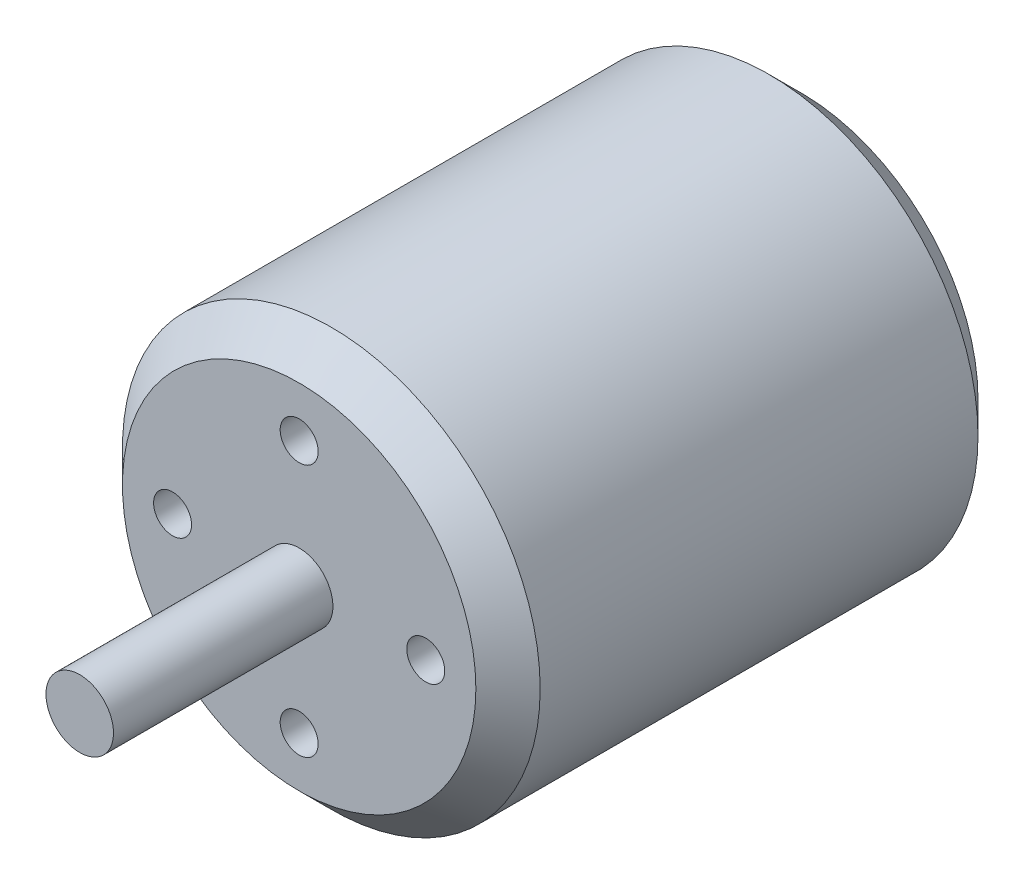
ISO-10303-21;
HEADER;
FILE_DESCRIPTION(('STEP AP214'),'2;1');
FILE_NAME('part.step','',(''),(''),'','','');
FILE_SCHEMA(('AUTOMOTIVE_DESIGN { 1 0 10303 214 1 1 1 1 }'));
ENDSEC;
DATA;
#1=APPLICATION_CONTEXT('core data for automotive mechanical design processes');
#2=APPLICATION_PROTOCOL_DEFINITION('international standard','automotive_design',2000,#1);
#3=PRODUCT_CONTEXT('',#1,'mechanical');
#4=PRODUCT('Part','Part','',(#3));
#5=PRODUCT_RELATED_PRODUCT_CATEGORY('part','',(#4));
#6=PRODUCT_DEFINITION_FORMATION('','',#4);
#7=PRODUCT_DEFINITION_CONTEXT('part definition',#1,'design');
#8=PRODUCT_DEFINITION('design','',#6,#7);
#9=PRODUCT_DEFINITION_SHAPE('','',#8);
#10=(LENGTH_UNIT() NAMED_UNIT(*) SI_UNIT(.MILLI.,.METRE.));
#11=(NAMED_UNIT(*) PLANE_ANGLE_UNIT() SI_UNIT($,.RADIAN.));
#12=(NAMED_UNIT(*) SI_UNIT($,.STERADIAN.) SOLID_ANGLE_UNIT());
#13=UNCERTAINTY_MEASURE_WITH_UNIT(LENGTH_MEASURE(1.E-05),#10,'distance_accuracy_value','');
#14=(GEOMETRIC_REPRESENTATION_CONTEXT(3) GLOBAL_UNCERTAINTY_ASSIGNED_CONTEXT((#13)) GLOBAL_UNIT_ASSIGNED_CONTEXT((#10,
#11,#12)) REPRESENTATION_CONTEXT('',''));
#15=CARTESIAN_POINT('',(0.,0.,0.));
#16=DIRECTION('',(0.,0.,1.));
#17=DIRECTION('',(1.,0.,0.));
#18=AXIS2_PLACEMENT_3D('',#15,#16,#17);
#19=CARTESIAN_POINT('',(0.,0.,59.5));
#20=DIRECTION('',(0.,0.,-1.));
#21=DIRECTION('',(-1.,0.,0.));
#22=AXIS2_PLACEMENT_3D('',#19,#20,#21);
#23=CYLINDRICAL_SURFACE('',#22,24.75);
#24=CARTESIAN_POINT('',(0.,0.,3.81000000000001));
#25=DIRECTION('',(0.,0.,1.));
#26=DIRECTION('',(1.,0.,0.));
#27=AXIS2_PLACEMENT_3D('',#24,#25,#26);
#28=CIRCLE('',#27,24.75);
#29=CARTESIAN_POINT('',(24.75,0.,3.81000000000001));
#30=VERTEX_POINT('',#29);
#31=EDGE_CURVE('E47',#30,#30,#28,.T.);
#32=ORIENTED_EDGE('',*,*,#31,.T.);
#33=EDGE_LOOP('',(#32));
#34=FACE_BOUND('',#33,.T.);
#35=CARTESIAN_POINT('',(0.,0.,55.69));
#36=DIRECTION('',(0.,0.,1.));
#37=DIRECTION('',(1.,0.,0.));
#38=AXIS2_PLACEMENT_3D('',#35,#36,#37);
#39=CIRCLE('',#38,24.75);
#40=CARTESIAN_POINT('',(24.75,0.,55.69));
#41=VERTEX_POINT('',#40);
#42=EDGE_CURVE('E52',#41,#41,#39,.F.);
#43=ORIENTED_EDGE('',*,*,#42,.T.);
#44=EDGE_LOOP('',(#43));
#45=FACE_BOUND('',#44,.T.);
#46=ADVANCED_FACE('F38',(#34,#45),#23,.T.);
#47=CARTESIAN_POINT('',(0.,0.,59.5));
#48=DIRECTION('',(0.,0.,1.));
#49=DIRECTION('',(1.,0.,0.));
#50=AXIS2_PLACEMENT_3D('',#47,#48,#49);
#51=PLANE('',#50);
#52=CARTESIAN_POINT('',(0.,15.,59.5));
#53=DIRECTION('',(0.,0.,1.));
#54=DIRECTION('',(1.,0.,0.));
#55=AXIS2_PLACEMENT_3D('',#52,#53,#54);
#56=CIRCLE('',#55,2.25);
#57=CARTESIAN_POINT('',(2.25,15.,59.5));
#58=VERTEX_POINT('',#57);
#59=EDGE_CURVE('E96',#58,#58,#56,.T.);
#60=ORIENTED_EDGE('',*,*,#59,.F.);
#61=EDGE_LOOP('',(#60));
#62=FACE_BOUND('',#61,.T.);
#63=CARTESIAN_POINT('',(15.0000000000004,4.23570186157979E-13,59.5));
#64=DIRECTION('',(0.,0.,1.));
#65=DIRECTION('',(1.,0.,0.));
#66=AXIS2_PLACEMENT_3D('',#63,#64,#65);
#67=CIRCLE('',#66,2.25000000000033);
#68=CARTESIAN_POINT('',(17.2500000000007,4.23570186157979E-13,59.5));
#69=VERTEX_POINT('',#68);
#70=EDGE_CURVE('E88',#69,#69,#67,.T.);
#71=ORIENTED_EDGE('',*,*,#70,.F.);
#72=EDGE_LOOP('',(#71));
#73=FACE_BOUND('',#72,.T.);
#74=CARTESIAN_POINT('',(8.47140372315957E-13,-15.,59.5));
#75=DIRECTION('',(0.,0.,1.));
#76=DIRECTION('',(1.,0.,0.));
#77=AXIS2_PLACEMENT_3D('',#74,#75,#76);
#78=CIRCLE('',#77,2.25000000000091);
#79=CARTESIAN_POINT('',(2.25000000000176,-15.,59.5));
#80=VERTEX_POINT('',#79);
#81=EDGE_CURVE('E80',#80,#80,#78,.T.);
#82=ORIENTED_EDGE('',*,*,#81,.F.);
#83=EDGE_LOOP('',(#82));
#84=FACE_BOUND('',#83,.T.);
#85=CARTESIAN_POINT('',(-14.9999999999996,-4.254071563567E-13,59.5));
#86=DIRECTION('',(0.,0.,1.));
#87=DIRECTION('',(1.,0.,0.));
#88=AXIS2_PLACEMENT_3D('',#85,#86,#87);
#89=CIRCLE('',#88,2.25000000000068);
#90=CARTESIAN_POINT('',(-12.7499999999989,-4.254071563567E-13,59.5));
#91=VERTEX_POINT('',#90);
#92=EDGE_CURVE('E72',#91,#91,#89,.T.);
#93=ORIENTED_EDGE('',*,*,#92,.F.);
#94=EDGE_LOOP('',(#93));
#95=FACE_BOUND('',#94,.T.);
#96=CARTESIAN_POINT('',(0.,0.,59.5));
#97=DIRECTION('',(0.,0.,1.));
#98=DIRECTION('',(1.,0.,0.));
#99=AXIS2_PLACEMENT_3D('',#96,#97,#98);
#100=CIRCLE('',#99,20.94);
#101=CARTESIAN_POINT('',(20.94,0.,59.5));
#102=VERTEX_POINT('',#101);
#103=EDGE_CURVE('E57',#102,#102,#100,.T.);
#104=ORIENTED_EDGE('',*,*,#103,.T.);
#105=EDGE_LOOP('',(#104));
#106=FACE_BOUND('',#105,.T.);
#107=CARTESIAN_POINT('',(0.,0.,59.5));
#108=DIRECTION('',(0.,0.,1.));
#109=DIRECTION('',(1.,0.,0.));
#110=AXIS2_PLACEMENT_3D('',#107,#108,#109);
#111=CIRCLE('',#110,4.);
#112=CARTESIAN_POINT('',(-4.,0.,59.5));
#113=VERTEX_POINT('',#112);
#114=EDGE_CURVE('E63',#113,#113,#111,.T.);
#115=ORIENTED_EDGE('',*,*,#114,.F.);
#116=EDGE_LOOP('',(#115));
#117=FACE_BOUND('',#116,.T.);
#118=ADVANCED_FACE('F113',(#62,#73,#84,#95,#106,#117),#51,.T.);
#119=CARTESIAN_POINT('',(0.,0.,0.));
#120=DIRECTION('',(0.,0.,1.));
#121=DIRECTION('',(1.,0.,0.));
#122=AXIS2_PLACEMENT_3D('',#119,#120,#121);
#123=PLANE('',#122);
#124=CARTESIAN_POINT('',(0.,0.,0.));
#125=DIRECTION('',(0.,0.,1.));
#126=DIRECTION('',(1.,0.,0.));
#127=AXIS2_PLACEMENT_3D('',#124,#125,#126);
#128=CIRCLE('',#127,20.94);
#129=CARTESIAN_POINT('',(20.94,0.,0.));
#130=VERTEX_POINT('',#129);
#131=EDGE_CURVE('E10',#130,#130,#128,.F.);
#132=ORIENTED_EDGE('',*,*,#131,.T.);
#133=EDGE_LOOP('',(#132));
#134=FACE_BOUND('',#133,.T.);
#135=ADVANCED_FACE('F116',(#134),#123,.F.);
#136=CARTESIAN_POINT('',(0.,0.,85.5));
#137=DIRECTION('',(0.,0.,-1.));
#138=DIRECTION('',(-1.,0.,0.));
#139=AXIS2_PLACEMENT_3D('',#136,#137,#138);
#140=CYLINDRICAL_SURFACE('',#139,4.);
#141=CARTESIAN_POINT('',(0.,0.,85.5));
#142=DIRECTION('',(0.,0.,1.));
#143=DIRECTION('',(1.,0.,0.));
#144=AXIS2_PLACEMENT_3D('',#141,#142,#143);
#145=CIRCLE('',#144,4.);
#146=CARTESIAN_POINT('',(-4.,0.,85.5));
#147=VERTEX_POINT('',#146);
#148=EDGE_CURVE('E67',#147,#147,#145,.T.);
#149=CARTESIAN_POINT('',(-4.,0.,85.5));
#150=CARTESIAN_POINT('',(-4.,0.,85.2291666666666));
#151=CARTESIAN_POINT('',(-4.,0.,84.9583333333333));
#152=CARTESIAN_POINT('',(-4.,0.,84.4166666666667));
#153=CARTESIAN_POINT('',(-4.,0.,84.1458333333333));
#154=CARTESIAN_POINT('',(-4.,0.,83.6041666666667));
#155=CARTESIAN_POINT('',(-4.,0.,83.3333333333333));
#156=CARTESIAN_POINT('',(-4.,0.,82.7916666666667));
#157=CARTESIAN_POINT('',(-4.,0.,82.5208333333333));
#158=CARTESIAN_POINT('',(-4.,0.,81.9791666666667));
#159=CARTESIAN_POINT('',(-4.,0.,81.7083333333333));
#160=CARTESIAN_POINT('',(-4.,0.,81.1666666666667));
#161=CARTESIAN_POINT('',(-4.,0.,80.8958333333333));
#162=CARTESIAN_POINT('',(-4.,0.,80.3541666666667));
#163=CARTESIAN_POINT('',(-4.,0.,80.0833333333333));
#164=CARTESIAN_POINT('',(-4.,0.,79.5416666666666));
#165=CARTESIAN_POINT('',(-4.,0.,79.2708333333333));
#166=CARTESIAN_POINT('',(-4.,0.,78.7291666666667));
#167=CARTESIAN_POINT('',(-4.,0.,78.4583333333333));
#168=CARTESIAN_POINT('',(-4.,0.,77.9166666666667));
#169=CARTESIAN_POINT('',(-4.,0.,77.6458333333333));
#170=CARTESIAN_POINT('',(-4.,0.,77.1041666666667));
#171=CARTESIAN_POINT('',(-4.,0.,76.8333333333333));
#172=CARTESIAN_POINT('',(-4.,0.,76.2916666666667));
#173=CARTESIAN_POINT('',(-4.,0.,76.0208333333333));
#174=CARTESIAN_POINT('',(-4.,0.,75.4791666666667));
#175=CARTESIAN_POINT('',(-4.,0.,75.2083333333333));
#176=CARTESIAN_POINT('',(-4.,0.,74.6666666666667));
#177=CARTESIAN_POINT('',(-4.,0.,74.3958333333333));
#178=CARTESIAN_POINT('',(-4.,0.,73.8541666666667));
#179=CARTESIAN_POINT('',(-4.,0.,73.5833333333333));
#180=CARTESIAN_POINT('',(-4.,0.,73.0416666666667));
#181=CARTESIAN_POINT('',(-4.,0.,72.7708333333333));
#182=CARTESIAN_POINT('',(-4.,0.,72.2291666666667));
#183=CARTESIAN_POINT('',(-4.,0.,71.9583333333333));
#184=CARTESIAN_POINT('',(-4.,0.,71.4166666666667));
#185=CARTESIAN_POINT('',(-4.,0.,71.1458333333333));
#186=CARTESIAN_POINT('',(-4.,0.,70.6041666666667));
#187=CARTESIAN_POINT('',(-4.,0.,70.3333333333333));
#188=CARTESIAN_POINT('',(-4.,0.,69.7916666666667));
#189=CARTESIAN_POINT('',(-4.,0.,69.5208333333333));
#190=CARTESIAN_POINT('',(-4.,0.,68.9791666666667));
#191=CARTESIAN_POINT('',(-4.,0.,68.7083333333333));
#192=CARTESIAN_POINT('',(-4.,0.,68.1666666666667));
#193=CARTESIAN_POINT('',(-4.,0.,67.8958333333333));
#194=CARTESIAN_POINT('',(-4.,0.,67.3541666666667));
#195=CARTESIAN_POINT('',(-4.,0.,67.0833333333333));
#196=CARTESIAN_POINT('',(-4.,0.,66.5416666666667));
#197=CARTESIAN_POINT('',(-4.,0.,66.2708333333333));
#198=CARTESIAN_POINT('',(-4.,0.,65.7291666666667));
#199=CARTESIAN_POINT('',(-4.,0.,65.4583333333333));
#200=CARTESIAN_POINT('',(-4.,0.,64.9166666666667));
#201=CARTESIAN_POINT('',(-4.,0.,64.6458333333333));
#202=CARTESIAN_POINT('',(-4.,0.,64.1041666666667));
#203=CARTESIAN_POINT('',(-4.,0.,63.8333333333333));
#204=CARTESIAN_POINT('',(-4.,0.,63.2916666666667));
#205=CARTESIAN_POINT('',(-4.,0.,63.0208333333333));
#206=CARTESIAN_POINT('',(-4.,0.,62.4791666666667));
#207=CARTESIAN_POINT('',(-4.,0.,62.2083333333333));
#208=CARTESIAN_POINT('',(-4.,0.,61.6666666666667));
#209=CARTESIAN_POINT('',(-4.,0.,61.3958333333333));
#210=CARTESIAN_POINT('',(-4.,0.,60.8541666666667));
#211=CARTESIAN_POINT('',(-4.,0.,60.5833333333333));
#212=CARTESIAN_POINT('',(-4.,0.,60.0416666666667));
#213=CARTESIAN_POINT('',(-4.,0.,59.7708333333333));
#214=CARTESIAN_POINT('',(-4.,0.,59.5));
#215=B_SPLINE_CURVE_WITH_KNOTS('',3,(#149,#150,#151,#152,#153,#154,#155,#156,#157,#158,#159,
#160,#161,#162,#163,#164,#165,#166,#167,#168,#169,#170,#171,#172,#173,#174,#175,#176,#177,#178,
#179,#180,#181,#182,#183,#184,#185,#186,#187,#188,#189,#190,#191,#192,#193,#194,#195,#196,#197,
#198,#199,#200,#201,#202,#203,#204,#205,#206,#207,#208,#209,#210,#211,#212,#213,#214),
.UNSPECIFIED.,.F.,.F.,(4,2,2,2,2,2,2,2,2,2,2,2,2,2,2,2,2,2,2,2,2,2,2,2,2,2,2,2,2,2,2,2,4),(0.,
0.812499999999994,1.62499999999999,2.4375,3.24999999999999,4.0625,4.87499999999999,5.6875,
6.49999999999999,7.31249999999999,8.12499999999999,8.93749999999999,9.74999999999999,10.5625,
11.375,12.1875,13.,13.8125,14.625,15.4375,16.25,17.0625,17.875,18.6875,19.5,20.3125,21.125,
21.9375,22.75,23.5625,24.375,25.1875,26.),.UNSPECIFIED.);
#216=EDGE_CURVE('BSEAM128',#147,#113,#215,.T.);
#217=ORIENTED_EDGE('',*,*,#148,.F.);
#218=ORIENTED_EDGE('',*,*,#114,.T.);
#219=ORIENTED_EDGE('',*,*,#216,.T.);
#220=ORIENTED_EDGE('',*,*,#216,.F.);
#221=EDGE_LOOP('',(#217,#219,#218,#220));
#222=FACE_BOUND('',#221,.T.);
#223=ADVANCED_FACE('F128',(#222),#140,.T.);
#224=CARTESIAN_POINT('',(0.,0.,85.5));
#225=DIRECTION('',(0.,0.,1.));
#226=DIRECTION('',(1.,0.,0.));
#227=AXIS2_PLACEMENT_3D('',#224,#225,#226);
#228=PLANE('',#227);
#229=ORIENTED_EDGE('',*,*,#148,.T.);
#230=EDGE_LOOP('',(#229));
#231=FACE_BOUND('',#230,.T.);
#232=ADVANCED_FACE('F130',(#231),#228,.T.);
#233=CARTESIAN_POINT('',(0.,0.,59.5));
#234=DIRECTION('',(0.,0.,-1.));
#235=DIRECTION('',(-1.,0.,0.));
#236=AXIS2_PLACEMENT_3D('',#233,#234,#235);
#237=CONICAL_SURFACE('',#236,20.94,0.785398163397447);
#238=ORIENTED_EDGE('',*,*,#42,.F.);
#239=EDGE_LOOP('',(#238));
#240=FACE_BOUND('',#239,.T.);
#241=ORIENTED_EDGE('',*,*,#103,.F.);
#242=EDGE_LOOP('',(#241));
#243=FACE_BOUND('',#242,.T.);
#244=ADVANCED_FACE('F137',(#240,#243),#237,.T.);
#245=CARTESIAN_POINT('',(0.,0.,3.81000000000001));
#246=DIRECTION('',(0.,0.,1.));
#247=DIRECTION('',(1.,0.,0.));
#248=AXIS2_PLACEMENT_3D('',#245,#246,#247);
#249=CONICAL_SURFACE('',#248,24.75,0.785398163397451);
#250=CARTESIAN_POINT('',(20.94,0.,0.));
#251=CARTESIAN_POINT('',(20.9796875,0.,0.0396874999999993));
#252=CARTESIAN_POINT('',(21.019375,0.,0.0793749999999995));
#253=CARTESIAN_POINT('',(21.09875,0.,0.15875));
#254=CARTESIAN_POINT('',(21.1384375,0.,0.1984375));
#255=CARTESIAN_POINT('',(21.2178125,0.,0.2778125));
#256=CARTESIAN_POINT('',(21.2575,0.,0.3175));
#257=CARTESIAN_POINT('',(21.336875,0.,0.396875));
#258=CARTESIAN_POINT('',(21.3765625,0.,0.436562500000001));
#259=CARTESIAN_POINT('',(21.4559375,0.,0.515937500000001));
#260=CARTESIAN_POINT('',(21.495625,0.,0.555625));
#261=CARTESIAN_POINT('',(21.575,0.,0.635000000000001));
#262=CARTESIAN_POINT('',(21.6146875,0.,0.674687500000001));
#263=CARTESIAN_POINT('',(21.6940625,0.,0.754062500000002));
#264=CARTESIAN_POINT('',(21.73375,0.,0.793750000000001));
#265=CARTESIAN_POINT('',(21.813125,0.,0.873125000000001));
#266=CARTESIAN_POINT('',(21.8528125,0.,0.912812500000001));
#267=CARTESIAN_POINT('',(21.9321875,0.,0.992187500000002));
#268=CARTESIAN_POINT('',(21.971875,0.,1.031875));
#269=CARTESIAN_POINT('',(22.05125,0.,1.11125));
#270=CARTESIAN_POINT('',(22.0909375,0.,1.1509375));
#271=CARTESIAN_POINT('',(22.1703125,0.,1.2303125));
#272=CARTESIAN_POINT('',(22.21,0.,1.27));
#273=CARTESIAN_POINT('',(22.289375,0.,1.349375));
#274=CARTESIAN_POINT('',(22.3290625,0.,1.3890625));
#275=CARTESIAN_POINT('',(22.4084375,0.,1.4684375));
#276=CARTESIAN_POINT('',(22.448125,0.,1.508125));
#277=CARTESIAN_POINT('',(22.5275,0.,1.5875));
#278=CARTESIAN_POINT('',(22.5671875,0.,1.6271875));
#279=CARTESIAN_POINT('',(22.6465625,0.,1.7065625));
#280=CARTESIAN_POINT('',(22.68625,0.,1.74625));
#281=CARTESIAN_POINT('',(22.765625,0.,1.825625));
#282=CARTESIAN_POINT('',(22.8053125,0.,1.8653125));
#283=CARTESIAN_POINT('',(22.8846875,0.,1.9446875));
#284=CARTESIAN_POINT('',(22.924375,0.,1.984375));
#285=CARTESIAN_POINT('',(23.00375,0.,2.06375));
#286=CARTESIAN_POINT('',(23.0434375,0.,2.1034375));
#287=CARTESIAN_POINT('',(23.1228125,0.,2.1828125));
#288=CARTESIAN_POINT('',(23.1625,0.,2.2225));
#289=CARTESIAN_POINT('',(23.241875,0.,2.301875));
#290=CARTESIAN_POINT('',(23.2815625,0.,2.3415625));
#291=CARTESIAN_POINT('',(23.3609375,0.,2.42093750000001));
#292=CARTESIAN_POINT('',(23.400625,0.,2.46062500000001));
#293=CARTESIAN_POINT('',(23.48,0.,2.54000000000001));
#294=CARTESIAN_POINT('',(23.5196875,0.,2.57968750000001));
#295=CARTESIAN_POINT('',(23.5990625,0.,2.6590625));
#296=CARTESIAN_POINT('',(23.63875,0.,2.69875000000001));
#297=CARTESIAN_POINT('',(23.718125,0.,2.77812500000001));
#298=CARTESIAN_POINT('',(23.7578125,0.,2.81781250000001));
#299=CARTESIAN_POINT('',(23.8371875,0.,2.89718750000001));
#300=CARTESIAN_POINT('',(23.876875,0.,2.93687500000001));
#301=CARTESIAN_POINT('',(23.95625,0.,3.01625000000001));
#302=CARTESIAN_POINT('',(23.9959375,0.,3.05593750000001));
#303=CARTESIAN_POINT('',(24.0753125,0.,3.13531250000001));
#304=CARTESIAN_POINT('',(24.115,0.,3.17500000000001));
#305=CARTESIAN_POINT('',(24.194375,0.,3.25437500000001));
#306=CARTESIAN_POINT('',(24.2340625,0.,3.29406250000001));
#307=CARTESIAN_POINT('',(24.3134375,0.,3.37343750000001));
#308=CARTESIAN_POINT('',(24.353125,0.,3.41312500000001));
#309=CARTESIAN_POINT('',(24.4325,0.,3.49250000000001));
#310=CARTESIAN_POINT('',(24.4721875,0.,3.53218750000001));
#311=CARTESIAN_POINT('',(24.5515625,0.,3.61156250000001));
#312=CARTESIAN_POINT('',(24.59125,0.,3.65125000000001));
#313=CARTESIAN_POINT('',(24.670625,0.,3.73062500000001));
#314=CARTESIAN_POINT('',(24.7103125,0.,3.77031250000001));
#315=CARTESIAN_POINT('',(24.75,0.,3.81000000000001));
#316=B_SPLINE_CURVE_WITH_KNOTS('',3,(#250,#251,#252,#253,#254,#255,#256,#257,#258,#259,#260,
#261,#262,#263,#264,#265,#266,#267,#268,#269,#270,#271,#272,#273,#274,#275,#276,#277,#278,#279,
#280,#281,#282,#283,#284,#285,#286,#287,#288,#289,#290,#291,#292,#293,#294,#295,#296,#297,#298,
#299,#300,#301,#302,#303,#304,#305,#306,#307,#308,#309,#310,#311,#312,#313,#314,#315),
.UNSPECIFIED.,.F.,.F.,(4,2,2,2,2,2,2,2,2,2,2,2,2,2,2,2,2,2,2,2,2,2,2,2,2,2,2,2,2,2,2,2,4),(0.,
0.168379802270046,0.336759604540093,0.505139406810141,0.673519209080188,0.841899011350237,
1.01027881362028,1.17865861589033,1.34703841816038,1.51541822043042,1.68379802270047,
1.85217782497052,2.02055762724057,2.18893742951061,2.35731723178066,2.52569703405071,
2.69407683632076,2.8624566385908,3.03083644086085,3.1992162431309,3.36759604540095,
3.53597584767099,3.70435564994104,3.87273545221109,4.04111525448114,4.20949505675118,
4.37787485902123,4.54625466129128,4.71463446356132,4.88301426583137,5.05139406810142,
5.21977387037147,5.38815367264151),.UNSPECIFIED.);
#317=EDGE_CURVE('BSEAM41',#130,#30,#316,.T.);
#318=ORIENTED_EDGE('',*,*,#131,.F.);
#319=ORIENTED_EDGE('',*,*,#31,.F.);
#320=ORIENTED_EDGE('',*,*,#317,.T.);
#321=ORIENTED_EDGE('',*,*,#317,.F.);
#322=EDGE_LOOP('',(#318,#320,#319,#321));
#323=FACE_BOUND('',#322,.T.);
#324=ADVANCED_FACE('F41',(#323),#249,.T.);
#325=CARTESIAN_POINT('',(-14.9999999999996,-4.254071563567E-13,46.8));
#326=DIRECTION('',(0.,0.,1.));
#327=DIRECTION('',(1.,0.,0.));
#328=AXIS2_PLACEMENT_3D('',#325,#326,#327);
#329=CYLINDRICAL_SURFACE('',#328,2.25000000000068);
#330=CARTESIAN_POINT('',(-14.9999999999996,-4.254071563567E-13,46.8));
#331=DIRECTION('',(0.,0.,1.));
#332=DIRECTION('',(1.,0.,0.));
#333=AXIS2_PLACEMENT_3D('',#330,#331,#332);
#334=CIRCLE('',#333,2.25000000000068);
#335=CARTESIAN_POINT('',(-12.7499999999989,-4.254071563567E-13,46.8));
#336=VERTEX_POINT('',#335);
#337=EDGE_CURVE('E76',#336,#336,#334,.T.);
#338=ORIENTED_EDGE('',*,*,#337,.F.);
#339=EDGE_LOOP('',(#338));
#340=FACE_BOUND('',#339,.T.);
#341=ORIENTED_EDGE('',*,*,#92,.T.);
#342=EDGE_LOOP('',(#341));
#343=FACE_BOUND('',#342,.T.);
#344=ADVANCED_FACE('F155',(#340,#343),#329,.F.);
#345=CARTESIAN_POINT('',(-14.9999999999996,-4.254071563567E-13,46.8));
#346=DIRECTION('',(0.,0.,1.));
#347=DIRECTION('',(1.,0.,0.));
#348=AXIS2_PLACEMENT_3D('',#345,#346,#347);
#349=PLANE('',#348);
#350=ORIENTED_EDGE('',*,*,#337,.T.);
#351=EDGE_LOOP('',(#350));
#352=FACE_BOUND('',#351,.T.);
#353=ADVANCED_FACE('F162',(#352),#349,.T.);
#354=CARTESIAN_POINT('',(8.47140372315957E-13,-15.,46.8));
#355=DIRECTION('',(0.,0.,1.));
#356=DIRECTION('',(1.,0.,0.));
#357=AXIS2_PLACEMENT_3D('',#354,#355,#356);
#358=CYLINDRICAL_SURFACE('',#357,2.25000000000091);
#359=CARTESIAN_POINT('',(8.47140372315957E-13,-15.,46.8));
#360=DIRECTION('',(0.,0.,1.));
#361=DIRECTION('',(1.,0.,0.));
#362=AXIS2_PLACEMENT_3D('',#359,#360,#361);
#363=CIRCLE('',#362,2.25000000000091);
#364=CARTESIAN_POINT('',(2.25000000000176,-15.,46.8));
#365=VERTEX_POINT('',#364);
#366=EDGE_CURVE('E84',#365,#365,#363,.T.);
#367=ORIENTED_EDGE('',*,*,#366,.F.);
#368=EDGE_LOOP('',(#367));
#369=FACE_BOUND('',#368,.T.);
#370=ORIENTED_EDGE('',*,*,#81,.T.);
#371=EDGE_LOOP('',(#370));
#372=FACE_BOUND('',#371,.T.);
#373=ADVANCED_FACE('F169',(#369,#372),#358,.F.);
#374=CARTESIAN_POINT('',(8.47140372315957E-13,-15.,46.8));
#375=DIRECTION('',(0.,0.,1.));
#376=DIRECTION('',(1.,0.,0.));
#377=AXIS2_PLACEMENT_3D('',#374,#375,#376);
#378=PLANE('',#377);
#379=ORIENTED_EDGE('',*,*,#366,.T.);
#380=EDGE_LOOP('',(#379));
#381=FACE_BOUND('',#380,.T.);
#382=ADVANCED_FACE('F177',(#381),#378,.T.);
#383=CARTESIAN_POINT('',(15.0000000000004,4.23570186157979E-13,46.8));
#384=DIRECTION('',(0.,0.,1.));
#385=DIRECTION('',(1.,0.,0.));
#386=AXIS2_PLACEMENT_3D('',#383,#384,#385);
#387=CYLINDRICAL_SURFACE('',#386,2.25000000000033);
#388=CARTESIAN_POINT('',(15.0000000000004,4.23570186157979E-13,46.8));
#389=DIRECTION('',(0.,0.,1.));
#390=DIRECTION('',(1.,0.,0.));
#391=AXIS2_PLACEMENT_3D('',#388,#389,#390);
#392=CIRCLE('',#391,2.25000000000033);
#393=CARTESIAN_POINT('',(17.2500000000007,4.23570186157979E-13,46.8));
#394=VERTEX_POINT('',#393);
#395=EDGE_CURVE('E92',#394,#394,#392,.T.);
#396=ORIENTED_EDGE('',*,*,#395,.F.);
#397=EDGE_LOOP('',(#396));
#398=FACE_BOUND('',#397,.T.);
#399=ORIENTED_EDGE('',*,*,#70,.T.);
#400=EDGE_LOOP('',(#399));
#401=FACE_BOUND('',#400,.T.);
#402=ADVANCED_FACE('F181',(#398,#401),#387,.F.);
#403=CARTESIAN_POINT('',(15.0000000000004,4.23570186157979E-13,46.8));
#404=DIRECTION('',(0.,0.,1.));
#405=DIRECTION('',(1.,0.,0.));
#406=AXIS2_PLACEMENT_3D('',#403,#404,#405);
#407=PLANE('',#406);
#408=ORIENTED_EDGE('',*,*,#395,.T.);
#409=EDGE_LOOP('',(#408));
#410=FACE_BOUND('',#409,.T.);
#411=ADVANCED_FACE('F109',(#410),#407,.T.);
#412=CARTESIAN_POINT('',(0.,15.,46.8));
#413=DIRECTION('',(0.,0.,1.));
#414=DIRECTION('',(1.,0.,0.));
#415=AXIS2_PLACEMENT_3D('',#412,#413,#414);
#416=CYLINDRICAL_SURFACE('',#415,2.25);
#417=CARTESIAN_POINT('',(0.,15.,46.8));
#418=DIRECTION('',(0.,0.,1.));
#419=DIRECTION('',(1.,0.,0.));
#420=AXIS2_PLACEMENT_3D('',#417,#418,#419);
#421=CIRCLE('',#420,2.25);
#422=CARTESIAN_POINT('',(2.25,15.,46.8));
#423=VERTEX_POINT('',#422);
#424=EDGE_CURVE('E71',#423,#423,#421,.T.);
#425=ORIENTED_EDGE('',*,*,#424,.F.);
#426=EDGE_LOOP('',(#425));
#427=FACE_BOUND('',#426,.T.);
#428=ORIENTED_EDGE('',*,*,#59,.T.);
#429=EDGE_LOOP('',(#428));
#430=FACE_BOUND('',#429,.T.);
#431=ADVANCED_FACE('F106',(#427,#430),#416,.F.);
#432=CARTESIAN_POINT('',(0.,15.,46.8));
#433=DIRECTION('',(0.,0.,1.));
#434=DIRECTION('',(1.,0.,0.));
#435=AXIS2_PLACEMENT_3D('',#432,#433,#434);
#436=PLANE('',#435);
#437=ORIENTED_EDGE('',*,*,#424,.T.);
#438=EDGE_LOOP('',(#437));
#439=FACE_BOUND('',#438,.T.);
#440=ADVANCED_FACE('F104',(#439),#436,.T.);
#441=CLOSED_SHELL('',(#46,#118,#135,#223,#232,#244,#324,#344,#353,#373,#382,#402,#411,#431,#440));
#442=MANIFOLD_SOLID_BREP('B2',#441);
#443=ADVANCED_BREP_SHAPE_REPRESENTATION('',(#18,#442),#14);
#444=SHAPE_DEFINITION_REPRESENTATION(#9,#443);
ENDSEC;
END-ISO-10303-21;
